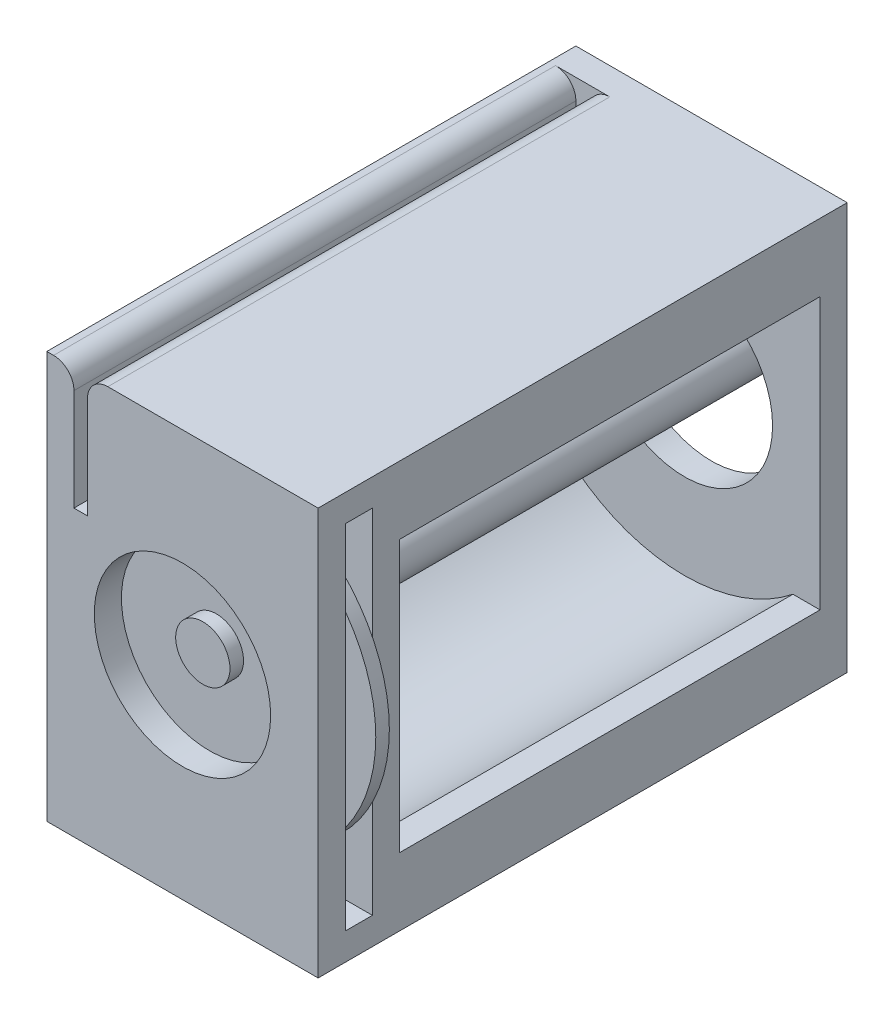
ISO-10303-21;
HEADER;
FILE_DESCRIPTION(('STEP AP214'),'2;1');
FILE_NAME('part.step','',(''),(''),'','','');
FILE_SCHEMA(('AUTOMOTIVE_DESIGN { 1 0 10303 214 1 1 1 1 }'));
ENDSEC;
DATA;
#1=APPLICATION_CONTEXT('core data for automotive mechanical design processes');
#2=APPLICATION_PROTOCOL_DEFINITION('international standard','automotive_design',2000,#1);
#3=PRODUCT_CONTEXT('',#1,'mechanical');
#4=PRODUCT('Part','Part','',(#3));
#5=PRODUCT_RELATED_PRODUCT_CATEGORY('part','',(#4));
#6=PRODUCT_DEFINITION_FORMATION('','',#4);
#7=PRODUCT_DEFINITION_CONTEXT('part definition',#1,'design');
#8=PRODUCT_DEFINITION('design','',#6,#7);
#9=PRODUCT_DEFINITION_SHAPE('','',#8);
#10=(LENGTH_UNIT() NAMED_UNIT(*) SI_UNIT(.MILLI.,.METRE.));
#11=(NAMED_UNIT(*) PLANE_ANGLE_UNIT() SI_UNIT($,.RADIAN.));
#12=(NAMED_UNIT(*) SI_UNIT($,.STERADIAN.) SOLID_ANGLE_UNIT());
#13=UNCERTAINTY_MEASURE_WITH_UNIT(LENGTH_MEASURE(1.E-05),#10,'distance_accuracy_value','');
#14=(GEOMETRIC_REPRESENTATION_CONTEXT(3) GLOBAL_UNCERTAINTY_ASSIGNED_CONTEXT((#13)) GLOBAL_UNIT_ASSIGNED_CONTEXT((#10,
#11,#12)) REPRESENTATION_CONTEXT('',''));
#15=CARTESIAN_POINT('',(0.,0.,0.));
#16=DIRECTION('',(0.,0.,1.));
#17=DIRECTION('',(1.,0.,0.));
#18=AXIS2_PLACEMENT_3D('',#15,#16,#17);
#19=CARTESIAN_POINT('',(0.,0.,-5.));
#20=DIRECTION('',(0.,0.,1.));
#21=DIRECTION('',(1.,0.,0.));
#22=AXIS2_PLACEMENT_3D('',#19,#20,#21);
#23=CYLINDRICAL_SURFACE('',#22,2.);
#24=CARTESIAN_POINT('',(0.,0.,-5.));
#25=DIRECTION('',(0.,0.,1.));
#26=DIRECTION('',(1.,0.,0.));
#27=AXIS2_PLACEMENT_3D('',#24,#25,#26);
#28=CIRCLE('',#27,2.);
#29=CARTESIAN_POINT('',(2.,0.,-5.));
#30=VERTEX_POINT('',#29);
#31=EDGE_CURVE('E11',#30,#30,#28,.T.);
#32=ORIENTED_EDGE('',*,*,#31,.T.);
#33=EDGE_LOOP('',(#32));
#34=FACE_BOUND('',#33,.T.);
#35=CARTESIAN_POINT('',(0.,0.,37.5));
#36=DIRECTION('',(0.,0.,1.));
#37=DIRECTION('',(1.,0.,0.));
#38=AXIS2_PLACEMENT_3D('',#35,#36,#37);
#39=CIRCLE('',#38,2.);
#40=CARTESIAN_POINT('',(2.,0.,37.5));
#41=VERTEX_POINT('',#40);
#42=EDGE_CURVE('E50',#41,#41,#39,.T.);
#43=ORIENTED_EDGE('',*,*,#42,.F.);
#44=EDGE_LOOP('',(#43));
#45=FACE_BOUND('',#44,.T.);
#46=ADVANCED_FACE('F44',(#34,#45),#23,.T.);
#47=CARTESIAN_POINT('',(0.,0.,-5.));
#48=DIRECTION('',(0.,0.,1.));
#49=DIRECTION('',(1.,0.,0.));
#50=AXIS2_PLACEMENT_3D('',#47,#48,#49);
#51=PLANE('',#50);
#52=ORIENTED_EDGE('',*,*,#31,.F.);
#53=EDGE_LOOP('',(#52));
#54=FACE_BOUND('',#53,.T.);
#55=ADVANCED_FACE('F59',(#54),#51,.F.);
#56=CARTESIAN_POINT('',(0.,0.,37.5));
#57=DIRECTION('',(0.,0.,1.));
#58=DIRECTION('',(1.,0.,0.));
#59=AXIS2_PLACEMENT_3D('',#56,#57,#58);
#60=PLANE('',#59);
#61=ORIENTED_EDGE('',*,*,#42,.T.);
#62=EDGE_LOOP('',(#61));
#63=FACE_BOUND('',#62,.T.);
#64=ADVANCED_FACE('F56',(#63),#60,.T.);
#65=CLOSED_SHELL('',(#46,#55,#64));
#66=MANIFOLD_SOLID_BREP('B2',#65);
#67=CARTESIAN_POINT('',(0.,0.,36.5));
#68=DIRECTION('',(0.,0.,1.));
#69=DIRECTION('',(1.,0.,0.));
#70=AXIS2_PLACEMENT_3D('',#67,#68,#69);
#71=PLANE('',#70);
#72=CARTESIAN_POINT('',(0.,0.,36.5));
#73=DIRECTION('',(0.,0.,1.));
#74=DIRECTION('',(1.,0.,0.));
#75=AXIS2_PLACEMENT_3D('',#72,#73,#74);
#76=CIRCLE('',#75,11.75);
#77=CARTESIAN_POINT('',(11.75,0.,36.5));
#78=VERTEX_POINT('',#77);
#79=EDGE_CURVE('E43',#78,#78,#76,.T.);
#80=ORIENTED_EDGE('',*,*,#79,.T.);
#81=EDGE_LOOP('',(#80));
#82=FACE_BOUND('',#81,.T.);
#83=CARTESIAN_POINT('',(0.,0.,36.5));
#84=DIRECTION('',(0.,0.,1.));
#85=DIRECTION('',(1.,0.,0.));
#86=AXIS2_PLACEMENT_3D('',#83,#84,#85);
#87=CIRCLE('',#86,2.);
#88=CARTESIAN_POINT('',(2.,0.,36.5));
#89=VERTEX_POINT('',#88);
#90=EDGE_CURVE('E105',#89,#89,#87,.T.);
#91=ORIENTED_EDGE('',*,*,#90,.F.);
#92=EDGE_LOOP('',(#91));
#93=FACE_BOUND('',#92,.T.);
#94=ADVANCED_FACE('F94',(#82,#93),#71,.T.);
#95=CARTESIAN_POINT('',(0.,0.,35.5));
#96=DIRECTION('',(0.,0.,1.));
#97=DIRECTION('',(1.,0.,0.));
#98=AXIS2_PLACEMENT_3D('',#95,#96,#97);
#99=PLANE('',#98);
#100=CARTESIAN_POINT('',(0.,0.,35.5));
#101=DIRECTION('',(0.,0.,1.));
#102=DIRECTION('',(1.,0.,0.));
#103=AXIS2_PLACEMENT_3D('',#100,#101,#102);
#104=CIRCLE('',#103,11.75);
#105=CARTESIAN_POINT('',(11.75,0.,35.5));
#106=VERTEX_POINT('',#105);
#107=EDGE_CURVE('E98',#106,#106,#104,.T.);
#108=ORIENTED_EDGE('',*,*,#107,.F.);
#109=EDGE_LOOP('',(#108));
#110=FACE_BOUND('',#109,.T.);
#111=CARTESIAN_POINT('',(0.,0.,35.5));
#112=DIRECTION('',(0.,0.,1.));
#113=DIRECTION('',(1.,0.,0.));
#114=AXIS2_PLACEMENT_3D('',#111,#112,#113);
#115=CIRCLE('',#114,2.);
#116=CARTESIAN_POINT('',(2.,0.,35.5));
#117=VERTEX_POINT('',#116);
#118=EDGE_CURVE('E107',#117,#117,#115,.T.);
#119=ORIENTED_EDGE('',*,*,#118,.T.);
#120=EDGE_LOOP('',(#119));
#121=FACE_BOUND('',#120,.T.);
#122=ADVANCED_FACE('F117',(#110,#121),#99,.F.);
#123=CARTESIAN_POINT('',(0.,0.,36.5));
#124=DIRECTION('',(0.,0.,-1.));
#125=DIRECTION('',(-1.,0.,0.));
#126=AXIS2_PLACEMENT_3D('',#123,#124,#125);
#127=CYLINDRICAL_SURFACE('',#126,11.75);
#128=ORIENTED_EDGE('',*,*,#79,.F.);
#129=EDGE_LOOP('',(#128));
#130=FACE_BOUND('',#129,.T.);
#131=ORIENTED_EDGE('',*,*,#107,.T.);
#132=EDGE_LOOP('',(#131));
#133=FACE_BOUND('',#132,.T.);
#134=ADVANCED_FACE('F96',(#130,#133),#127,.T.);
#135=CARTESIAN_POINT('',(0.,0.,36.5));
#136=DIRECTION('',(0.,0.,-1.));
#137=DIRECTION('',(-1.,0.,0.));
#138=AXIS2_PLACEMENT_3D('',#135,#136,#137);
#139=CYLINDRICAL_SURFACE('',#138,2.);
#140=ORIENTED_EDGE('',*,*,#90,.T.);
#141=EDGE_LOOP('',(#140));
#142=FACE_BOUND('',#141,.T.);
#143=ORIENTED_EDGE('',*,*,#118,.F.);
#144=EDGE_LOOP('',(#143));
#145=FACE_BOUND('',#144,.T.);
#146=ADVANCED_FACE('F113',(#142,#145),#139,.F.);
#147=CLOSED_SHELL('',(#94,#122,#134,#146));
#148=MANIFOLD_SOLID_BREP('B6',#147);
#149=CARTESIAN_POINT('',(0.,13.,39.));
#150=DIRECTION('',(0.,1.,0.));
#151=DIRECTION('',(0.,0.,1.));
#152=AXIS2_PLACEMENT_3D('',#149,#150,#151);
#153=PLANE('',#152);
#154=DIRECTION('',(-1.,0.,0.));
#155=VECTOR('',#154,1.);
#156=CARTESIAN_POINT('',(0.,13.,35.));
#157=LINE('',#156,#155);
#158=CARTESIAN_POINT('',(-8.,13.,35.));
#159=VERTEX_POINT('',#158);
#160=CARTESIAN_POINT('',(-10.,13.,35.));
#161=VERTEX_POINT('',#160);
#162=EDGE_CURVE('E525',#159,#161,#157,.T.);
#163=ORIENTED_EDGE('',*,*,#162,.F.);
#164=DIRECTION('',(0.,0.,1.));
#165=VECTOR('',#164,1.);
#166=CARTESIAN_POINT('',(-8.,13.,39.));
#167=LINE('',#166,#165);
#168=CARTESIAN_POINT('',(-8.,13.,37.));
#169=VERTEX_POINT('',#168);
#170=EDGE_CURVE('E382',#159,#169,#167,.T.);
#171=ORIENTED_EDGE('',*,*,#170,.T.);
#172=DIRECTION('',(1.,0.,0.));
#173=VECTOR('',#172,1.);
#174=CARTESIAN_POINT('',(0.,13.,37.));
#175=LINE('',#174,#173);
#176=CARTESIAN_POINT('',(-10.,13.,37.));
#177=VERTEX_POINT('',#176);
#178=EDGE_CURVE('E530',#177,#169,#175,.T.);
#179=ORIENTED_EDGE('',*,*,#178,.F.);
#180=DIRECTION('',(0.,0.,-1.));
#181=VECTOR('',#180,1.);
#182=CARTESIAN_POINT('',(-10.,13.,39.));
#183=LINE('',#182,#181);
#184=EDGE_CURVE('E420',#177,#161,#183,.T.);
#185=ORIENTED_EDGE('',*,*,#184,.T.);
#186=EDGE_LOOP('',(#163,#171,#179,#185));
#187=FACE_BOUND('',#186,.T.);
#188=ADVANCED_FACE('F156',(#187),#153,.F.);
#189=CARTESIAN_POINT('',(-7.,13.,37.));
#190=VERTEX_POINT('',#189);
#191=CARTESIAN_POINT('',(10.,13.,37.));
#192=VERTEX_POINT('',#191);
#193=EDGE_CURVE('E529',#190,#192,#175,.T.);
#194=ORIENTED_EDGE('',*,*,#193,.F.);
#195=DIRECTION('',(0.,0.,-1.));
#196=VECTOR('',#195,1.);
#197=CARTESIAN_POINT('',(-7.,13.,39.));
#198=LINE('',#197,#196);
#199=CARTESIAN_POINT('',(-7.,13.,35.));
#200=VERTEX_POINT('',#199);
#201=EDGE_CURVE('E371',#190,#200,#198,.T.);
#202=ORIENTED_EDGE('',*,*,#201,.T.);
#203=CARTESIAN_POINT('',(10.,13.,35.));
#204=VERTEX_POINT('',#203);
#205=EDGE_CURVE('E526',#204,#200,#157,.T.);
#206=ORIENTED_EDGE('',*,*,#205,.F.);
#207=DIRECTION('',(0.,0.,-1.));
#208=VECTOR('',#207,1.);
#209=CARTESIAN_POINT('',(10.,13.,39.));
#210=LINE('',#209,#208);
#211=EDGE_CURVE('E423',#192,#204,#210,.T.);
#212=ORIENTED_EDGE('',*,*,#211,.F.);
#213=EDGE_LOOP('',(#194,#202,#206,#212));
#214=FACE_BOUND('',#213,.T.);
#215=ADVANCED_FACE('F650',(#214),#153,.F.);
#216=CARTESIAN_POINT('',(0.,0.,35.));
#217=DIRECTION('',(0.,0.,1.));
#218=DIRECTION('',(1.,0.,0.));
#219=AXIS2_PLACEMENT_3D('',#216,#217,#218);
#220=PLANE('',#219);
#221=DIRECTION('',(0.,-1.,0.));
#222=VECTOR('',#221,1.);
#223=CARTESIAN_POINT('',(-7.99999999999999,0.,35.));
#224=LINE('',#223,#222);
#225=CARTESIAN_POINT('',(-8.,6.,35.));
#226=VERTEX_POINT('',#225);
#227=EDGE_CURVE('E385',#159,#226,#224,.T.);
#228=ORIENTED_EDGE('',*,*,#227,.F.);
#229=ORIENTED_EDGE('',*,*,#162,.T.);
#230=DIRECTION('',(0.,-1.,0.));
#231=VECTOR('',#230,1.);
#232=CARTESIAN_POINT('',(-10.,0.,35.));
#233=LINE('',#232,#231);
#234=CARTESIAN_POINT('',(-10.,-13.,35.));
#235=VERTEX_POINT('',#234);
#236=EDGE_CURVE('E429',#161,#235,#233,.T.);
#237=ORIENTED_EDGE('',*,*,#236,.T.);
#238=DIRECTION('',(-1.,0.,0.));
#239=VECTOR('',#238,1.);
#240=CARTESIAN_POINT('',(0.,-13.,35.));
#241=LINE('',#240,#239);
#242=CARTESIAN_POINT('',(10.,-13.,35.));
#243=VERTEX_POINT('',#242);
#244=EDGE_CURVE('E395',#243,#235,#241,.T.);
#245=ORIENTED_EDGE('',*,*,#244,.F.);
#246=DIRECTION('',(0.,-1.,0.));
#247=VECTOR('',#246,1.);
#248=CARTESIAN_POINT('',(10.,0.,35.));
#249=LINE('',#248,#247);
#250=EDGE_CURVE('E426',#204,#243,#249,.T.);
#251=ORIENTED_EDGE('',*,*,#250,.F.);
#252=ORIENTED_EDGE('',*,*,#205,.T.);
#253=DIRECTION('',(0.,1.,0.));
#254=VECTOR('',#253,1.);
#255=CARTESIAN_POINT('',(-6.99999999999999,0.,35.));
#256=LINE('',#255,#254);
#257=CARTESIAN_POINT('',(-7.,6.,35.));
#258=VERTEX_POINT('',#257);
#259=EDGE_CURVE('E374',#258,#200,#256,.T.);
#260=ORIENTED_EDGE('',*,*,#259,.F.);
#261=DIRECTION('',(1.,0.,0.));
#262=VECTOR('',#261,1.);
#263=CARTESIAN_POINT('',(0.,6.,35.));
#264=LINE('',#263,#262);
#265=EDGE_CURVE('E369',#226,#258,#264,.T.);
#266=ORIENTED_EDGE('',*,*,#265,.F.);
#267=EDGE_LOOP('',(#228,#229,#237,#245,#251,#252,#260,#266));
#268=FACE_BOUND('',#267,.T.);
#269=CARTESIAN_POINT('',(0.,0.,35.));
#270=DIRECTION('',(0.,0.,1.));
#271=DIRECTION('',(1.,0.,0.));
#272=AXIS2_PLACEMENT_3D('',#269,#270,#271);
#273=CIRCLE('',#272,6.5);
#274=CARTESIAN_POINT('',(6.5,0.,35.));
#275=VERTEX_POINT('',#274);
#276=EDGE_CURVE('E433',#275,#275,#273,.T.);
#277=ORIENTED_EDGE('',*,*,#276,.F.);
#278=EDGE_LOOP('',(#277));
#279=FACE_BOUND('',#278,.T.);
#280=ADVANCED_FACE('F603',(#268,#279),#220,.T.);
#281=CARTESIAN_POINT('',(0.,10.,34.));
#282=DIRECTION('',(0.,1.,0.));
#283=DIRECTION('',(0.,0.,1.));
#284=AXIS2_PLACEMENT_3D('',#281,#282,#283);
#285=PLANE('',#284);
#286=DIRECTION('',(1.,0.,0.));
#287=VECTOR('',#286,1.);
#288=CARTESIAN_POINT('',(0.,10.,33.));
#289=LINE('',#288,#287);
#290=CARTESIAN_POINT('',(8.,10.,33.));
#291=VERTEX_POINT('',#290);
#292=CARTESIAN_POINT('',(10.,10.,33.));
#293=VERTEX_POINT('',#292);
#294=EDGE_CURVE('E453',#291,#293,#289,.T.);
#295=ORIENTED_EDGE('',*,*,#294,.F.);
#296=DIRECTION('',(0.,0.,-1.));
#297=VECTOR('',#296,1.);
#298=CARTESIAN_POINT('',(8.,10.,34.));
#299=LINE('',#298,#297);
#300=CARTESIAN_POINT('',(8.,10.,2.));
#301=VERTEX_POINT('',#300);
#302=EDGE_CURVE('E473',#291,#301,#299,.T.);
#303=ORIENTED_EDGE('',*,*,#302,.T.);
#304=DIRECTION('',(-1.,0.,0.));
#305=VECTOR('',#304,1.);
#306=CARTESIAN_POINT('',(0.,10.,2.));
#307=LINE('',#306,#305);
#308=CARTESIAN_POINT('',(10.,10.,2.));
#309=VERTEX_POINT('',#308);
#310=EDGE_CURVE('E488',#309,#301,#307,.T.);
#311=ORIENTED_EDGE('',*,*,#310,.F.);
#312=DIRECTION('',(0.,0.,-1.));
#313=VECTOR('',#312,1.);
#314=CARTESIAN_POINT('',(10.,10.,34.));
#315=LINE('',#314,#313);
#316=EDGE_CURVE('E480',#293,#309,#315,.T.);
#317=ORIENTED_EDGE('',*,*,#316,.F.);
#318=EDGE_LOOP('',(#295,#303,#311,#317));
#319=FACE_BOUND('',#318,.T.);
#320=ADVANCED_FACE('F642',(#319),#285,.F.);
#321=CARTESIAN_POINT('',(0.,10.,34.));
#322=DIRECTION('',(0.,1.,0.));
#323=DIRECTION('',(0.,0.,1.));
#324=AXIS2_PLACEMENT_3D('',#321,#322,#323);
#325=PLANE('',#324);
#326=DIRECTION('',(1.,0.,0.));
#327=VECTOR('',#326,1.);
#328=CARTESIAN_POINT('',(0.,10.,33.));
#329=LINE('',#328,#327);
#330=CARTESIAN_POINT('',(-10.,10.,33.));
#331=VERTEX_POINT('',#330);
#332=CARTESIAN_POINT('',(-8.,10.,33.));
#333=VERTEX_POINT('',#332);
#334=EDGE_CURVE('E450',#331,#333,#329,.T.);
#335=ORIENTED_EDGE('',*,*,#334,.F.);
#336=DIRECTION('',(0.,0.,-1.));
#337=VECTOR('',#336,1.);
#338=CARTESIAN_POINT('',(-10.,10.,34.));
#339=LINE('',#338,#337);
#340=CARTESIAN_POINT('',(-10.,10.,2.));
#341=VERTEX_POINT('',#340);
#342=EDGE_CURVE('E478',#331,#341,#339,.T.);
#343=ORIENTED_EDGE('',*,*,#342,.T.);
#344=DIRECTION('',(-1.,0.,0.));
#345=VECTOR('',#344,1.);
#346=CARTESIAN_POINT('',(0.,10.,2.));
#347=LINE('',#346,#345);
#348=CARTESIAN_POINT('',(-8.,10.,2.));
#349=VERTEX_POINT('',#348);
#350=EDGE_CURVE('E485',#349,#341,#347,.T.);
#351=ORIENTED_EDGE('',*,*,#350,.F.);
#352=DIRECTION('',(0.,0.,-1.));
#353=VECTOR('',#352,1.);
#354=CARTESIAN_POINT('',(-8.,10.,34.));
#355=LINE('',#354,#353);
#356=EDGE_CURVE('E475',#333,#349,#355,.T.);
#357=ORIENTED_EDGE('',*,*,#356,.F.);
#358=EDGE_LOOP('',(#335,#343,#351,#357));
#359=FACE_BOUND('',#358,.T.);
#360=ADVANCED_FACE('F620',(#359),#325,.F.);
#361=CARTESIAN_POINT('',(0.,0.,34.));
#362=DIRECTION('',(0.,0.,-1.));
#363=DIRECTION('',(-1.,0.,0.));
#364=AXIS2_PLACEMENT_3D('',#361,#362,#363);
#365=CYLINDRICAL_SURFACE('',#364,12.8062484748657);
#366=CARTESIAN_POINT('',(0.,0.,33.));
#367=DIRECTION('',(0.,0.,1.));
#368=DIRECTION('',(1.,0.,0.));
#369=AXIS2_PLACEMENT_3D('',#366,#367,#368);
#370=CIRCLE('',#369,12.8062484748657);
#371=CARTESIAN_POINT('',(-7.,10.7238052947636,33.));
#372=VERTEX_POINT('',#371);
#373=EDGE_CURVE('E448',#372,#291,#370,.F.);
#374=ORIENTED_EDGE('',*,*,#373,.F.);
#375=DIRECTION('',(0.,0.,-1.));
#376=VECTOR('',#375,1.);
#377=CARTESIAN_POINT('',(-7.,10.7238052947636,34.));
#378=LINE('',#377,#376);
#379=CARTESIAN_POINT('',(-7.,10.7238052947636,2.));
#380=VERTEX_POINT('',#379);
#381=EDGE_CURVE('E379',#372,#380,#378,.T.);
#382=ORIENTED_EDGE('',*,*,#381,.T.);
#383=CARTESIAN_POINT('',(0.,0.,2.));
#384=DIRECTION('',(0.,0.,1.));
#385=DIRECTION('',(1.,0.,0.));
#386=AXIS2_PLACEMENT_3D('',#383,#384,#385);
#387=CIRCLE('',#386,12.8062484748657);
#388=EDGE_CURVE('E482',#301,#380,#387,.T.);
#389=ORIENTED_EDGE('',*,*,#388,.F.);
#390=ORIENTED_EDGE('',*,*,#302,.F.);
#391=EDGE_LOOP('',(#374,#382,#389,#390));
#392=FACE_BOUND('',#391,.T.);
#393=ADVANCED_FACE('F645',(#392),#365,.F.);
#394=CARTESIAN_POINT('',(0.,-10.,34.));
#395=DIRECTION('',(0.,1.,0.));
#396=DIRECTION('',(0.,0.,1.));
#397=AXIS2_PLACEMENT_3D('',#394,#395,#396);
#398=PLANE('',#397);
#399=DIRECTION('',(0.,0.,-1.));
#400=VECTOR('',#399,1.);
#401=CARTESIAN_POINT('',(8.,-10.,34.));
#402=LINE('',#401,#400);
#403=CARTESIAN_POINT('',(8.,-10.,33.));
#404=VERTEX_POINT('',#403);
#405=CARTESIAN_POINT('',(8.,-10.,2.));
#406=VERTEX_POINT('',#405);
#407=EDGE_CURVE('E460',#404,#406,#402,.T.);
#408=ORIENTED_EDGE('',*,*,#407,.F.);
#409=DIRECTION('',(1.,0.,0.));
#410=VECTOR('',#409,1.);
#411=CARTESIAN_POINT('',(0.,-10.,33.));
#412=LINE('',#411,#410);
#413=CARTESIAN_POINT('',(10.,-10.,33.));
#414=VERTEX_POINT('',#413);
#415=EDGE_CURVE('E446',#404,#414,#412,.T.);
#416=ORIENTED_EDGE('',*,*,#415,.T.);
#417=DIRECTION('',(0.,0.,-1.));
#418=VECTOR('',#417,1.);
#419=CARTESIAN_POINT('',(10.,-10.,34.));
#420=LINE('',#419,#418);
#421=CARTESIAN_POINT('',(10.,-10.,2.));
#422=VERTEX_POINT('',#421);
#423=EDGE_CURVE('E462',#414,#422,#420,.T.);
#424=ORIENTED_EDGE('',*,*,#423,.T.);
#425=DIRECTION('',(-1.,0.,0.));
#426=VECTOR('',#425,1.);
#427=CARTESIAN_POINT('',(0.,-10.,2.));
#428=LINE('',#427,#426);
#429=EDGE_CURVE('E470',#422,#406,#428,.T.);
#430=ORIENTED_EDGE('',*,*,#429,.T.);
#431=EDGE_LOOP('',(#408,#416,#424,#430));
#432=FACE_BOUND('',#431,.T.);
#433=ADVANCED_FACE('F636',(#432),#398,.T.);
#434=CARTESIAN_POINT('',(0.,0.,34.));
#435=DIRECTION('',(0.,0.,-1.));
#436=DIRECTION('',(-1.,0.,0.));
#437=AXIS2_PLACEMENT_3D('',#434,#435,#436);
#438=CYLINDRICAL_SURFACE('',#437,12.8062484748657);
#439=CARTESIAN_POINT('',(0.,0.,33.));
#440=DIRECTION('',(0.,0.,1.));
#441=DIRECTION('',(1.,0.,0.));
#442=AXIS2_PLACEMENT_3D('',#439,#440,#441);
#443=CIRCLE('',#442,12.8062484748657);
#444=CARTESIAN_POINT('',(-8.,-10.,33.));
#445=VERTEX_POINT('',#444);
#446=EDGE_CURVE('E436',#404,#445,#443,.F.);
#447=ORIENTED_EDGE('',*,*,#446,.F.);
#448=ORIENTED_EDGE('',*,*,#407,.T.);
#449=CARTESIAN_POINT('',(0.,0.,2.));
#450=DIRECTION('',(0.,0.,1.));
#451=DIRECTION('',(1.,0.,0.));
#452=AXIS2_PLACEMENT_3D('',#449,#450,#451);
#453=CIRCLE('',#452,12.8062484748657);
#454=CARTESIAN_POINT('',(-8.,-10.,2.));
#455=VERTEX_POINT('',#454);
#456=EDGE_CURVE('E467',#455,#406,#453,.T.);
#457=ORIENTED_EDGE('',*,*,#456,.F.);
#458=DIRECTION('',(0.,0.,-1.));
#459=VECTOR('',#458,1.);
#460=CARTESIAN_POINT('',(-8.,-10.,34.));
#461=LINE('',#460,#459);
#462=EDGE_CURVE('E458',#445,#455,#461,.T.);
#463=ORIENTED_EDGE('',*,*,#462,.F.);
#464=EDGE_LOOP('',(#447,#448,#457,#463));
#465=FACE_BOUND('',#464,.T.);
#466=ADVANCED_FACE('F632',(#465),#438,.F.);
#467=CARTESIAN_POINT('',(0.,-10.,34.));
#468=DIRECTION('',(0.,1.,0.));
#469=DIRECTION('',(0.,0.,1.));
#470=AXIS2_PLACEMENT_3D('',#467,#468,#469);
#471=PLANE('',#470);
#472=DIRECTION('',(0.,0.,-1.));
#473=VECTOR('',#472,1.);
#474=CARTESIAN_POINT('',(-10.,-10.,34.));
#475=LINE('',#474,#473);
#476=CARTESIAN_POINT('',(-10.,-10.,33.));
#477=VERTEX_POINT('',#476);
#478=CARTESIAN_POINT('',(-10.,-10.,2.));
#479=VERTEX_POINT('',#478);
#480=EDGE_CURVE('E456',#477,#479,#475,.T.);
#481=ORIENTED_EDGE('',*,*,#480,.F.);
#482=DIRECTION('',(1.,0.,0.));
#483=VECTOR('',#482,1.);
#484=CARTESIAN_POINT('',(0.,-10.,33.));
#485=LINE('',#484,#483);
#486=EDGE_CURVE('E523',#477,#445,#485,.T.);
#487=ORIENTED_EDGE('',*,*,#486,.T.);
#488=ORIENTED_EDGE('',*,*,#462,.T.);
#489=DIRECTION('',(-1.,0.,0.));
#490=VECTOR('',#489,1.);
#491=CARTESIAN_POINT('',(0.,-10.,2.));
#492=LINE('',#491,#490);
#493=EDGE_CURVE('E464',#455,#479,#492,.T.);
#494=ORIENTED_EDGE('',*,*,#493,.T.);
#495=EDGE_LOOP('',(#481,#487,#488,#494));
#496=FACE_BOUND('',#495,.T.);
#497=ADVANCED_FACE('F626',(#496),#471,.T.);
#498=CARTESIAN_POINT('',(0.,0.,2.));
#499=DIRECTION('',(0.,0.,1.));
#500=DIRECTION('',(1.,0.,0.));
#501=AXIS2_PLACEMENT_3D('',#498,#499,#500);
#502=PLANE('',#501);
#503=ORIENTED_EDGE('',*,*,#388,.T.);
#504=DIRECTION('',(0.,1.,0.));
#505=VECTOR('',#504,1.);
#506=CARTESIAN_POINT('',(-7.,15.,2.));
#507=LINE('',#506,#505);
#508=CARTESIAN_POINT('',(-7.,13.5,2.));
#509=VERTEX_POINT('',#508);
#510=EDGE_CURVE('E361',#380,#509,#507,.T.);
#511=ORIENTED_EDGE('',*,*,#510,.T.);
#512=CARTESIAN_POINT('',(-5.5,13.5,2.));
#513=DIRECTION('',(0.,0.,1.));
#514=DIRECTION('',(1.,0.,0.));
#515=AXIS2_PLACEMENT_3D('',#512,#513,#514);
#516=CIRCLE('',#515,1.5);
#517=CARTESIAN_POINT('',(-5.5,15.,2.));
#518=VERTEX_POINT('',#517);
#519=EDGE_CURVE('E92',#509,#518,#516,.F.);
#520=ORIENTED_EDGE('',*,*,#519,.T.);
#521=DIRECTION('',(-1.,0.,0.));
#522=VECTOR('',#521,1.);
#523=CARTESIAN_POINT('',(-8.,15.,2.));
#524=LINE('',#523,#522);
#525=CARTESIAN_POINT('',(-9.5,15.,2.));
#526=VERTEX_POINT('',#525);
#527=EDGE_CURVE('E178',#518,#526,#524,.T.);
#528=ORIENTED_EDGE('',*,*,#527,.T.);
#529=CARTESIAN_POINT('',(-9.5,13.5,2.));
#530=DIRECTION('',(0.,0.,1.));
#531=DIRECTION('',(1.,0.,0.));
#532=AXIS2_PLACEMENT_3D('',#529,#530,#531);
#533=CIRCLE('',#532,1.5);
#534=CARTESIAN_POINT('',(-8.,13.5,2.));
#535=VERTEX_POINT('',#534);
#536=EDGE_CURVE('E164',#526,#535,#533,.F.);
#537=ORIENTED_EDGE('',*,*,#536,.T.);
#538=DIRECTION('',(0.,-1.,0.));
#539=VECTOR('',#538,1.);
#540=CARTESIAN_POINT('',(-8.,15.,2.));
#541=LINE('',#540,#539);
#542=EDGE_CURVE('E359',#535,#349,#541,.T.);
#543=ORIENTED_EDGE('',*,*,#542,.T.);
#544=ORIENTED_EDGE('',*,*,#350,.T.);
#545=DIRECTION('',(0.,-1.,0.));
#546=VECTOR('',#545,1.);
#547=CARTESIAN_POINT('',(-10.,0.,2.));
#548=LINE('',#547,#546);
#549=EDGE_CURVE('E495',#341,#479,#548,.T.);
#550=ORIENTED_EDGE('',*,*,#549,.T.);
#551=ORIENTED_EDGE('',*,*,#493,.F.);
#552=ORIENTED_EDGE('',*,*,#456,.T.);
#553=ORIENTED_EDGE('',*,*,#429,.F.);
#554=DIRECTION('',(0.,-1.,0.));
#555=VECTOR('',#554,1.);
#556=CARTESIAN_POINT('',(10.,0.,2.));
#557=LINE('',#556,#555);
#558=EDGE_CURVE('E492',#309,#422,#557,.T.);
#559=ORIENTED_EDGE('',*,*,#558,.F.);
#560=ORIENTED_EDGE('',*,*,#310,.T.);
#561=EDGE_LOOP('',(#503,#511,#520,#528,#537,#543,#544,#550,#551,#552,#553,#559,#560));
#562=FACE_BOUND('',#561,.T.);
#563=CARTESIAN_POINT('',(0.,0.,2.));
#564=DIRECTION('',(0.,0.,1.));
#565=DIRECTION('',(1.,0.,0.));
#566=AXIS2_PLACEMENT_3D('',#563,#564,#565);
#567=CIRCLE('',#566,6.5);
#568=CARTESIAN_POINT('',(6.5,0.,2.));
#569=VERTEX_POINT('',#568);
#570=EDGE_CURVE('E499',#569,#569,#567,.T.);
#571=ORIENTED_EDGE('',*,*,#570,.F.);
#572=EDGE_LOOP('',(#571));
#573=FACE_BOUND('',#572,.T.);
#574=ADVANCED_FACE('F554',(#562,#573),#502,.T.);
#575=CARTESIAN_POINT('',(10.,0.,2.));
#576=DIRECTION('',(1.,0.,0.));
#577=DIRECTION('',(0.,1.,0.));
#578=AXIS2_PLACEMENT_3D('',#575,#576,#577);
#579=PLANE('',#578);
#580=ORIENTED_EDGE('',*,*,#250,.T.);
#581=DIRECTION('',(0.,0.,-1.));
#582=VECTOR('',#581,1.);
#583=CARTESIAN_POINT('',(10.,-13.,39.));
#584=LINE('',#583,#582);
#585=CARTESIAN_POINT('',(10.,-13.,37.));
#586=VERTEX_POINT('',#585);
#587=EDGE_CURVE('E390',#586,#243,#584,.T.);
#588=ORIENTED_EDGE('',*,*,#587,.F.);
#589=DIRECTION('',(0.,-1.,0.));
#590=VECTOR('',#589,1.);
#591=CARTESIAN_POINT('',(10.,0.,37.));
#592=LINE('',#591,#590);
#593=EDGE_CURVE('E397',#192,#586,#592,.T.);
#594=ORIENTED_EDGE('',*,*,#593,.F.);
#595=ORIENTED_EDGE('',*,*,#211,.T.);
#596=EDGE_LOOP('',(#580,#588,#594,#595));
#597=FACE_BOUND('',#596,.T.);
#598=DIRECTION('',(0.,-1.,0.));
#599=VECTOR('',#598,1.);
#600=CARTESIAN_POINT('',(10.,0.,39.));
#601=LINE('',#600,#599);
#602=CARTESIAN_POINT('',(10.,15.,39.));
#603=VERTEX_POINT('',#602);
#604=CARTESIAN_POINT('',(10.,-15.,39.));
#605=VERTEX_POINT('',#604);
#606=EDGE_CURVE('E405',#603,#605,#601,.T.);
#607=ORIENTED_EDGE('',*,*,#606,.T.);
#608=DIRECTION('',(0.,0.,-1.));
#609=VECTOR('',#608,1.);
#610=CARTESIAN_POINT('',(10.,-15.,2.));
#611=LINE('',#610,#609);
#612=CARTESIAN_POINT('',(10.,-15.,0.));
#613=VERTEX_POINT('',#612);
#614=EDGE_CURVE('E502',#605,#613,#611,.T.);
#615=ORIENTED_EDGE('',*,*,#614,.T.);
#616=DIRECTION('',(0.,-1.,0.));
#617=VECTOR('',#616,1.);
#618=CARTESIAN_POINT('',(10.,0.,0.));
#619=LINE('',#618,#617);
#620=CARTESIAN_POINT('',(10.,15.,0.));
#621=VERTEX_POINT('',#620);
#622=EDGE_CURVE('E491',#621,#613,#619,.T.);
#623=ORIENTED_EDGE('',*,*,#622,.F.);
#624=DIRECTION('',(0.,0.,-1.));
#625=VECTOR('',#624,1.);
#626=CARTESIAN_POINT('',(10.,15.,2.));
#627=LINE('',#626,#625);
#628=EDGE_CURVE('E521',#603,#621,#627,.T.);
#629=ORIENTED_EDGE('',*,*,#628,.F.);
#630=EDGE_LOOP('',(#607,#615,#623,#629));
#631=FACE_BOUND('',#630,.T.);
#632=DIRECTION('',(0.,-1.,0.));
#633=VECTOR('',#632,1.);
#634=CARTESIAN_POINT('',(10.,0.,33.));
#635=LINE('',#634,#633);
#636=EDGE_CURVE('E425',#293,#414,#635,.T.);
#637=ORIENTED_EDGE('',*,*,#636,.F.);
#638=ORIENTED_EDGE('',*,*,#316,.T.);
#639=ORIENTED_EDGE('',*,*,#558,.T.);
#640=ORIENTED_EDGE('',*,*,#423,.F.);
#641=EDGE_LOOP('',(#637,#638,#639,#640));
#642=FACE_BOUND('',#641,.T.);
#643=ADVANCED_FACE('F581',(#597,#631,#642),#579,.T.);
#644=CARTESIAN_POINT('',(0.,15.,2.));
#645=DIRECTION('',(0.,-1.,0.));
#646=DIRECTION('',(1.,0.,0.));
#647=AXIS2_PLACEMENT_3D('',#644,#645,#646);
#648=PLANE('',#647);
#649=DIRECTION('',(-1.,0.,0.));
#650=VECTOR('',#649,1.);
#651=CARTESIAN_POINT('',(0.,15.,39.));
#652=LINE('',#651,#650);
#653=CARTESIAN_POINT('',(-9.5,15.,39.));
#654=VERTEX_POINT('',#653);
#655=CARTESIAN_POINT('',(-10.,15.,39.));
#656=VERTEX_POINT('',#655);
#657=EDGE_CURVE('E414',#654,#656,#652,.T.);
#658=ORIENTED_EDGE('',*,*,#657,.F.);
#659=DIRECTION('',(0.,0.,1.));
#660=VECTOR('',#659,1.);
#661=CARTESIAN_POINT('',(-9.5,15.,2.));
#662=LINE('',#661,#660);
#663=EDGE_CURVE('E550',#654,#526,#662,.F.);
#664=ORIENTED_EDGE('',*,*,#663,.T.);
#665=ORIENTED_EDGE('',*,*,#527,.F.);
#666=DIRECTION('',(0.,0.,1.));
#667=VECTOR('',#666,1.);
#668=CARTESIAN_POINT('',(-5.5,15.,2.));
#669=LINE('',#668,#667);
#670=CARTESIAN_POINT('',(-5.5,15.,39.));
#671=VERTEX_POINT('',#670);
#672=EDGE_CURVE('E547',#518,#671,#669,.T.);
#673=ORIENTED_EDGE('',*,*,#672,.T.);
#674=EDGE_CURVE('E415',#603,#671,#652,.T.);
#675=ORIENTED_EDGE('',*,*,#674,.F.);
#676=ORIENTED_EDGE('',*,*,#628,.T.);
#677=DIRECTION('',(-1.,0.,0.));
#678=VECTOR('',#677,1.);
#679=CARTESIAN_POINT('',(0.,15.,0.));
#680=LINE('',#679,#678);
#681=CARTESIAN_POINT('',(-10.,15.,0.));
#682=VERTEX_POINT('',#681);
#683=EDGE_CURVE('E504',#621,#682,#680,.T.);
#684=ORIENTED_EDGE('',*,*,#683,.T.);
#685=DIRECTION('',(0.,0.,-1.));
#686=VECTOR('',#685,1.);
#687=CARTESIAN_POINT('',(-10.,15.,2.));
#688=LINE('',#687,#686);
#689=EDGE_CURVE('E519',#656,#682,#688,.T.);
#690=ORIENTED_EDGE('',*,*,#689,.F.);
#691=EDGE_LOOP('',(#658,#664,#665,#673,#675,#676,#684,#690));
#692=FACE_BOUND('',#691,.T.);
#693=ADVANCED_FACE('F567',(#692),#648,.F.);
#694=CARTESIAN_POINT('',(-10.,0.,2.));
#695=DIRECTION('',(1.,0.,0.));
#696=DIRECTION('',(0.,1.,0.));
#697=AXIS2_PLACEMENT_3D('',#694,#695,#696);
#698=PLANE('',#697);
#699=DIRECTION('',(0.,0.,-1.));
#700=VECTOR('',#699,1.);
#701=CARTESIAN_POINT('',(-10.,-13.,39.));
#702=LINE('',#701,#700);
#703=CARTESIAN_POINT('',(-10.,-13.,37.));
#704=VERTEX_POINT('',#703);
#705=EDGE_CURVE('E392',#704,#235,#702,.T.);
#706=ORIENTED_EDGE('',*,*,#705,.T.);
#707=ORIENTED_EDGE('',*,*,#236,.F.);
#708=ORIENTED_EDGE('',*,*,#184,.F.);
#709=DIRECTION('',(0.,-1.,0.));
#710=VECTOR('',#709,1.);
#711=CARTESIAN_POINT('',(-10.,0.,37.));
#712=LINE('',#711,#710);
#713=EDGE_CURVE('E407',#177,#704,#712,.T.);
#714=ORIENTED_EDGE('',*,*,#713,.T.);
#715=EDGE_LOOP('',(#706,#707,#708,#714));
#716=FACE_BOUND('',#715,.T.);
#717=DIRECTION('',(0.,-1.,0.));
#718=VECTOR('',#717,1.);
#719=CARTESIAN_POINT('',(-10.,0.,0.));
#720=LINE('',#719,#718);
#721=CARTESIAN_POINT('',(-10.,-15.,0.));
#722=VERTEX_POINT('',#721);
#723=EDGE_CURVE('E507',#682,#722,#720,.T.);
#724=ORIENTED_EDGE('',*,*,#723,.T.);
#725=DIRECTION('',(0.,0.,-1.));
#726=VECTOR('',#725,1.);
#727=CARTESIAN_POINT('',(-10.,-15.,2.));
#728=LINE('',#727,#726);
#729=CARTESIAN_POINT('',(-10.,-15.,39.));
#730=VERTEX_POINT('',#729);
#731=EDGE_CURVE('E516',#730,#722,#728,.T.);
#732=ORIENTED_EDGE('',*,*,#731,.F.);
#733=DIRECTION('',(0.,-1.,0.));
#734=VECTOR('',#733,1.);
#735=CARTESIAN_POINT('',(-10.,0.,39.));
#736=LINE('',#735,#734);
#737=EDGE_CURVE('E417',#656,#730,#736,.T.);
#738=ORIENTED_EDGE('',*,*,#737,.F.);
#739=ORIENTED_EDGE('',*,*,#689,.T.);
#740=EDGE_LOOP('',(#724,#732,#738,#739));
#741=FACE_BOUND('',#740,.T.);
#742=ORIENTED_EDGE('',*,*,#342,.F.);
#743=DIRECTION('',(0.,-1.,0.));
#744=VECTOR('',#743,1.);
#745=CARTESIAN_POINT('',(-10.,0.,33.));
#746=LINE('',#745,#744);
#747=EDGE_CURVE('E439',#331,#477,#746,.T.);
#748=ORIENTED_EDGE('',*,*,#747,.T.);
#749=ORIENTED_EDGE('',*,*,#480,.T.);
#750=ORIENTED_EDGE('',*,*,#549,.F.);
#751=EDGE_LOOP('',(#742,#748,#749,#750));
#752=FACE_BOUND('',#751,.T.);
#753=ADVANCED_FACE('F572',(#716,#741,#752),#698,.F.);
#754=CARTESIAN_POINT('',(0.,-15.,2.));
#755=DIRECTION('',(0.,-1.,0.));
#756=DIRECTION('',(1.,0.,0.));
#757=AXIS2_PLACEMENT_3D('',#754,#755,#756);
#758=PLANE('',#757);
#759=ORIENTED_EDGE('',*,*,#731,.T.);
#760=DIRECTION('',(-1.,0.,0.));
#761=VECTOR('',#760,1.);
#762=CARTESIAN_POINT('',(0.,-15.,0.));
#763=LINE('',#762,#761);
#764=EDGE_CURVE('E509',#613,#722,#763,.T.);
#765=ORIENTED_EDGE('',*,*,#764,.F.);
#766=ORIENTED_EDGE('',*,*,#614,.F.);
#767=DIRECTION('',(-1.,0.,0.));
#768=VECTOR('',#767,1.);
#769=CARTESIAN_POINT('',(0.,-15.,39.));
#770=LINE('',#769,#768);
#771=EDGE_CURVE('E398',#605,#730,#770,.T.);
#772=ORIENTED_EDGE('',*,*,#771,.T.);
#773=EDGE_LOOP('',(#759,#765,#766,#772));
#774=FACE_BOUND('',#773,.T.);
#775=ADVANCED_FACE('F577',(#774),#758,.T.);
#776=CARTESIAN_POINT('',(0.,0.,2.));
#777=DIRECTION('',(0.,0.,-1.));
#778=DIRECTION('',(-1.,0.,0.));
#779=AXIS2_PLACEMENT_3D('',#776,#777,#778);
#780=CYLINDRICAL_SURFACE('',#779,6.5);
#781=ORIENTED_EDGE('',*,*,#570,.T.);
#782=EDGE_LOOP('',(#781));
#783=FACE_BOUND('',#782,.T.);
#784=CARTESIAN_POINT('',(0.,0.,0.));
#785=DIRECTION('',(0.,0.,1.));
#786=DIRECTION('',(1.,0.,0.));
#787=AXIS2_PLACEMENT_3D('',#784,#785,#786);
#788=CIRCLE('',#787,6.5);
#789=CARTESIAN_POINT('',(6.5,0.,0.));
#790=VERTEX_POINT('',#789);
#791=EDGE_CURVE('E496',#790,#790,#788,.T.);
#792=ORIENTED_EDGE('',*,*,#791,.F.);
#793=EDGE_LOOP('',(#792));
#794=FACE_BOUND('',#793,.T.);
#795=ADVANCED_FACE('F696',(#783,#794),#780,.F.);
#796=CARTESIAN_POINT('',(0.,0.,0.));
#797=DIRECTION('',(0.,0.,1.));
#798=DIRECTION('',(1.,0.,0.));
#799=AXIS2_PLACEMENT_3D('',#796,#797,#798);
#800=PLANE('',#799);
#801=ORIENTED_EDGE('',*,*,#622,.T.);
#802=ORIENTED_EDGE('',*,*,#764,.T.);
#803=ORIENTED_EDGE('',*,*,#723,.F.);
#804=ORIENTED_EDGE('',*,*,#683,.F.);
#805=EDGE_LOOP('',(#801,#802,#803,#804));
#806=FACE_BOUND('',#805,.T.);
#807=ORIENTED_EDGE('',*,*,#791,.T.);
#808=EDGE_LOOP('',(#807));
#809=FACE_BOUND('',#808,.T.);
#810=ADVANCED_FACE('F678',(#806,#809),#800,.F.);
#811=CARTESIAN_POINT('',(0.,0.,33.));
#812=DIRECTION('',(0.,0.,1.));
#813=DIRECTION('',(1.,0.,0.));
#814=AXIS2_PLACEMENT_3D('',#811,#812,#813);
#815=PLANE('',#814);
#816=ORIENTED_EDGE('',*,*,#334,.T.);
#817=DIRECTION('',(0.,-1.,0.));
#818=VECTOR('',#817,1.);
#819=CARTESIAN_POINT('',(-7.99999999999999,0.,33.));
#820=LINE('',#819,#818);
#821=CARTESIAN_POINT('',(-8.,6.,33.));
#822=VERTEX_POINT('',#821);
#823=EDGE_CURVE('E387',#333,#822,#820,.T.);
#824=ORIENTED_EDGE('',*,*,#823,.T.);
#825=DIRECTION('',(1.,0.,0.));
#826=VECTOR('',#825,1.);
#827=CARTESIAN_POINT('',(0.,6.,33.));
#828=LINE('',#827,#826);
#829=CARTESIAN_POINT('',(-7.,6.,33.));
#830=VERTEX_POINT('',#829);
#831=EDGE_CURVE('E366',#822,#830,#828,.T.);
#832=ORIENTED_EDGE('',*,*,#831,.T.);
#833=DIRECTION('',(0.,1.,0.));
#834=VECTOR('',#833,1.);
#835=CARTESIAN_POINT('',(-6.99999999999999,0.,33.));
#836=LINE('',#835,#834);
#837=EDGE_CURVE('E376',#830,#372,#836,.T.);
#838=ORIENTED_EDGE('',*,*,#837,.T.);
#839=ORIENTED_EDGE('',*,*,#373,.T.);
#840=ORIENTED_EDGE('',*,*,#294,.T.);
#841=ORIENTED_EDGE('',*,*,#636,.T.);
#842=ORIENTED_EDGE('',*,*,#415,.F.);
#843=ORIENTED_EDGE('',*,*,#446,.T.);
#844=ORIENTED_EDGE('',*,*,#486,.F.);
#845=ORIENTED_EDGE('',*,*,#747,.F.);
#846=EDGE_LOOP('',(#816,#824,#832,#838,#839,#840,#841,#842,#843,#844,#845));
#847=FACE_BOUND('',#846,.T.);
#848=CARTESIAN_POINT('',(0.,0.,33.));
#849=DIRECTION('',(0.,0.,1.));
#850=DIRECTION('',(1.,0.,0.));
#851=AXIS2_PLACEMENT_3D('',#848,#849,#850);
#852=CIRCLE('',#851,6.5);
#853=CARTESIAN_POINT('',(6.5,0.,33.));
#854=VERTEX_POINT('',#853);
#855=EDGE_CURVE('E430',#854,#854,#852,.T.);
#856=ORIENTED_EDGE('',*,*,#855,.T.);
#857=EDGE_LOOP('',(#856));
#858=FACE_BOUND('',#857,.T.);
#859=ADVANCED_FACE('F615',(#847,#858),#815,.F.);
#860=CARTESIAN_POINT('',(0.,0.,35.));
#861=DIRECTION('',(0.,0.,-1.));
#862=DIRECTION('',(-1.,0.,0.));
#863=AXIS2_PLACEMENT_3D('',#860,#861,#862);
#864=CYLINDRICAL_SURFACE('',#863,6.5);
#865=ORIENTED_EDGE('',*,*,#276,.T.);
#866=EDGE_LOOP('',(#865));
#867=FACE_BOUND('',#866,.T.);
#868=ORIENTED_EDGE('',*,*,#855,.F.);
#869=EDGE_LOOP('',(#868));
#870=FACE_BOUND('',#869,.T.);
#871=ADVANCED_FACE('F677',(#867,#870),#864,.F.);
#872=CARTESIAN_POINT('',(0.,0.,39.));
#873=DIRECTION('',(0.,0.,1.));
#874=DIRECTION('',(1.,0.,0.));
#875=AXIS2_PLACEMENT_3D('',#872,#873,#874);
#876=PLANE('',#875);
#877=DIRECTION('',(0.,-1.,0.));
#878=VECTOR('',#877,1.);
#879=CARTESIAN_POINT('',(-8.,15.,39.));
#880=LINE('',#879,#878);
#881=CARTESIAN_POINT('',(-8.,13.5,39.));
#882=VERTEX_POINT('',#881);
#883=CARTESIAN_POINT('',(-8.,6.,39.));
#884=VERTEX_POINT('',#883);
#885=EDGE_CURVE('E353',#882,#884,#880,.T.);
#886=ORIENTED_EDGE('',*,*,#885,.F.);
#887=CARTESIAN_POINT('',(-9.5,13.5,39.));
#888=DIRECTION('',(0.,0.,1.));
#889=DIRECTION('',(1.,0.,0.));
#890=AXIS2_PLACEMENT_3D('',#887,#888,#889);
#891=CIRCLE('',#890,1.5);
#892=EDGE_CURVE('E545',#882,#654,#891,.T.);
#893=ORIENTED_EDGE('',*,*,#892,.T.);
#894=ORIENTED_EDGE('',*,*,#657,.T.);
#895=ORIENTED_EDGE('',*,*,#737,.T.);
#896=ORIENTED_EDGE('',*,*,#771,.F.);
#897=ORIENTED_EDGE('',*,*,#606,.F.);
#898=ORIENTED_EDGE('',*,*,#674,.T.);
#899=CARTESIAN_POINT('',(-5.5,13.5,39.));
#900=DIRECTION('',(0.,0.,1.));
#901=DIRECTION('',(1.,0.,0.));
#902=AXIS2_PLACEMENT_3D('',#899,#900,#901);
#903=CIRCLE('',#902,1.5);
#904=CARTESIAN_POINT('',(-7.,13.5,39.));
#905=VERTEX_POINT('',#904);
#906=EDGE_CURVE('E358',#671,#905,#903,.T.);
#907=ORIENTED_EDGE('',*,*,#906,.T.);
#908=DIRECTION('',(0.,1.,0.));
#909=VECTOR('',#908,1.);
#910=CARTESIAN_POINT('',(-7.,15.,39.));
#911=LINE('',#910,#909);
#912=CARTESIAN_POINT('',(-7.,6.,39.));
#913=VERTEX_POINT('',#912);
#914=EDGE_CURVE('E337',#913,#905,#911,.T.);
#915=ORIENTED_EDGE('',*,*,#914,.F.);
#916=DIRECTION('',(1.,0.,0.));
#917=VECTOR('',#916,1.);
#918=CARTESIAN_POINT('',(-8.,6.,39.));
#919=LINE('',#918,#917);
#920=EDGE_CURVE('E347',#884,#913,#919,.T.);
#921=ORIENTED_EDGE('',*,*,#920,.F.);
#922=EDGE_LOOP('',(#886,#893,#894,#895,#896,#897,#898,#907,#915,#921));
#923=FACE_BOUND('',#922,.T.);
#924=CARTESIAN_POINT('',(0.,0.,39.));
#925=DIRECTION('',(0.,0.,1.));
#926=DIRECTION('',(1.,0.,0.));
#927=AXIS2_PLACEMENT_3D('',#924,#925,#926);
#928=CIRCLE('',#927,6.5);
#929=CARTESIAN_POINT('',(6.5,0.,39.));
#930=VERTEX_POINT('',#929);
#931=EDGE_CURVE('E401',#930,#930,#928,.T.);
#932=ORIENTED_EDGE('',*,*,#931,.F.);
#933=EDGE_LOOP('',(#932));
#934=FACE_BOUND('',#933,.T.);
#935=ADVANCED_FACE('F355',(#923,#934),#876,.T.);
#936=CARTESIAN_POINT('',(0.,0.,37.));
#937=DIRECTION('',(0.,0.,1.));
#938=DIRECTION('',(1.,0.,0.));
#939=AXIS2_PLACEMENT_3D('',#936,#937,#938);
#940=PLANE('',#939);
#941=ORIENTED_EDGE('',*,*,#178,.T.);
#942=DIRECTION('',(0.,-1.,0.));
#943=VECTOR('',#942,1.);
#944=CARTESIAN_POINT('',(-7.99999999999999,0.,37.));
#945=LINE('',#944,#943);
#946=CARTESIAN_POINT('',(-8.,6.,37.));
#947=VERTEX_POINT('',#946);
#948=EDGE_CURVE('E538',#169,#947,#945,.T.);
#949=ORIENTED_EDGE('',*,*,#948,.T.);
#950=DIRECTION('',(1.,0.,0.));
#951=VECTOR('',#950,1.);
#952=CARTESIAN_POINT('',(0.,6.,37.));
#953=LINE('',#952,#951);
#954=CARTESIAN_POINT('',(-7.,6.,37.));
#955=VERTEX_POINT('',#954);
#956=EDGE_CURVE('E535',#947,#955,#953,.T.);
#957=ORIENTED_EDGE('',*,*,#956,.T.);
#958=DIRECTION('',(0.,1.,0.));
#959=VECTOR('',#958,1.);
#960=CARTESIAN_POINT('',(-6.99999999999999,0.,37.));
#961=LINE('',#960,#959);
#962=EDGE_CURVE('E339',#955,#190,#961,.T.);
#963=ORIENTED_EDGE('',*,*,#962,.T.);
#964=ORIENTED_EDGE('',*,*,#193,.T.);
#965=ORIENTED_EDGE('',*,*,#593,.T.);
#966=DIRECTION('',(-1.,0.,0.));
#967=VECTOR('',#966,1.);
#968=CARTESIAN_POINT('',(0.,-13.,37.));
#969=LINE('',#968,#967);
#970=EDGE_CURVE('E533',#586,#704,#969,.T.);
#971=ORIENTED_EDGE('',*,*,#970,.T.);
#972=ORIENTED_EDGE('',*,*,#713,.F.);
#973=EDGE_LOOP('',(#941,#949,#957,#963,#964,#965,#971,#972));
#974=FACE_BOUND('',#973,.T.);
#975=CARTESIAN_POINT('',(0.,0.,37.));
#976=DIRECTION('',(0.,0.,1.));
#977=DIRECTION('',(1.,0.,0.));
#978=AXIS2_PLACEMENT_3D('',#975,#976,#977);
#979=CIRCLE('',#978,6.5);
#980=CARTESIAN_POINT('',(6.5,0.,37.));
#981=VERTEX_POINT('',#980);
#982=EDGE_CURVE('E402',#981,#981,#979,.T.);
#983=ORIENTED_EDGE('',*,*,#982,.T.);
#984=EDGE_LOOP('',(#983));
#985=FACE_BOUND('',#984,.T.);
#986=ADVANCED_FACE('F591',(#974,#985),#940,.F.);
#987=CARTESIAN_POINT('',(0.,0.,39.));
#988=DIRECTION('',(0.,0.,-1.));
#989=DIRECTION('',(-1.,0.,0.));
#990=AXIS2_PLACEMENT_3D('',#987,#988,#989);
#991=CYLINDRICAL_SURFACE('',#990,6.5);
#992=ORIENTED_EDGE('',*,*,#931,.T.);
#993=EDGE_LOOP('',(#992));
#994=FACE_BOUND('',#993,.T.);
#995=ORIENTED_EDGE('',*,*,#982,.F.);
#996=EDGE_LOOP('',(#995));
#997=FACE_BOUND('',#996,.T.);
#998=ADVANCED_FACE('F744',(#994,#997),#991,.F.);
#999=CARTESIAN_POINT('',(0.,-13.,39.));
#1000=DIRECTION('',(0.,1.,0.));
#1001=DIRECTION('',(0.,0.,1.));
#1002=AXIS2_PLACEMENT_3D('',#999,#1000,#1001);
#1003=PLANE('',#1002);
#1004=ORIENTED_EDGE('',*,*,#587,.T.);
#1005=ORIENTED_EDGE('',*,*,#244,.T.);
#1006=ORIENTED_EDGE('',*,*,#705,.F.);
#1007=ORIENTED_EDGE('',*,*,#970,.F.);
#1008=EDGE_LOOP('',(#1004,#1005,#1006,#1007));
#1009=FACE_BOUND('',#1008,.T.);
#1010=ADVANCED_FACE('F656',(#1009),#1003,.T.);
#1011=CARTESIAN_POINT('',(-8.,15.,2.));
#1012=DIRECTION('',(-1.,0.,0.));
#1013=DIRECTION('',(0.,-1.,0.));
#1014=AXIS2_PLACEMENT_3D('',#1011,#1012,#1013);
#1015=PLANE('',#1014);
#1016=ORIENTED_EDGE('',*,*,#542,.F.);
#1017=DIRECTION('',(0.,0.,1.));
#1018=VECTOR('',#1017,1.);
#1019=CARTESIAN_POINT('',(-8.,13.5,2.));
#1020=LINE('',#1019,#1018);
#1021=EDGE_CURVE('E541',#535,#882,#1020,.T.);
#1022=ORIENTED_EDGE('',*,*,#1021,.T.);
#1023=ORIENTED_EDGE('',*,*,#885,.T.);
#1024=DIRECTION('',(0.,0.,1.));
#1025=VECTOR('',#1024,1.);
#1026=CARTESIAN_POINT('',(-8.,6.,2.));
#1027=LINE('',#1026,#1025);
#1028=EDGE_CURVE('E350',#947,#884,#1027,.T.);
#1029=ORIENTED_EDGE('',*,*,#1028,.F.);
#1030=ORIENTED_EDGE('',*,*,#948,.F.);
#1031=ORIENTED_EDGE('',*,*,#170,.F.);
#1032=ORIENTED_EDGE('',*,*,#227,.T.);
#1033=EDGE_CURVE('E343',#822,#226,#1027,.T.);
#1034=ORIENTED_EDGE('',*,*,#1033,.F.);
#1035=ORIENTED_EDGE('',*,*,#823,.F.);
#1036=ORIENTED_EDGE('',*,*,#356,.T.);
#1037=EDGE_LOOP('',(#1016,#1022,#1023,#1029,#1030,#1031,#1032,#1034,#1035,#1036));
#1038=FACE_BOUND('',#1037,.T.);
#1039=ADVANCED_FACE('F560',(#1038),#1015,.F.);
#1040=CARTESIAN_POINT('',(-7.,15.,2.));
#1041=DIRECTION('',(1.,0.,0.));
#1042=DIRECTION('',(0.,1.,0.));
#1043=AXIS2_PLACEMENT_3D('',#1040,#1041,#1042);
#1044=PLANE('',#1043);
#1045=ORIENTED_EDGE('',*,*,#914,.T.);
#1046=DIRECTION('',(0.,0.,1.));
#1047=VECTOR('',#1046,1.);
#1048=CARTESIAN_POINT('',(-7.,13.5,2.));
#1049=LINE('',#1048,#1047);
#1050=EDGE_CURVE('E171',#905,#509,#1049,.F.);
#1051=ORIENTED_EDGE('',*,*,#1050,.T.);
#1052=ORIENTED_EDGE('',*,*,#510,.F.);
#1053=ORIENTED_EDGE('',*,*,#381,.F.);
#1054=ORIENTED_EDGE('',*,*,#837,.F.);
#1055=DIRECTION('',(0.,0.,1.));
#1056=VECTOR('',#1055,1.);
#1057=CARTESIAN_POINT('',(-7.,6.,2.));
#1058=LINE('',#1057,#1056);
#1059=EDGE_CURVE('E342',#830,#258,#1058,.T.);
#1060=ORIENTED_EDGE('',*,*,#1059,.T.);
#1061=ORIENTED_EDGE('',*,*,#259,.T.);
#1062=ORIENTED_EDGE('',*,*,#201,.F.);
#1063=ORIENTED_EDGE('',*,*,#962,.F.);
#1064=EDGE_CURVE('E333',#955,#913,#1058,.T.);
#1065=ORIENTED_EDGE('',*,*,#1064,.T.);
#1066=EDGE_LOOP('',(#1045,#1051,#1052,#1053,#1054,#1060,#1061,#1062,#1063,#1065));
#1067=FACE_BOUND('',#1066,.T.);
#1068=ADVANCED_FACE('F335',(#1067),#1044,.F.);
#1069=CARTESIAN_POINT('',(-8.,6.,2.));
#1070=DIRECTION('',(0.,-1.,0.));
#1071=DIRECTION('',(0.,0.,-1.));
#1072=AXIS2_PLACEMENT_3D('',#1069,#1070,#1071);
#1073=PLANE('',#1072);
#1074=ORIENTED_EDGE('',*,*,#265,.T.);
#1075=ORIENTED_EDGE('',*,*,#1059,.F.);
#1076=ORIENTED_EDGE('',*,*,#831,.F.);
#1077=ORIENTED_EDGE('',*,*,#1033,.T.);
#1078=EDGE_LOOP('',(#1074,#1075,#1076,#1077));
#1079=FACE_BOUND('',#1078,.T.);
#1080=ADVANCED_FACE('F611',(#1079),#1073,.F.);
#1081=ORIENTED_EDGE('',*,*,#1028,.T.);
#1082=ORIENTED_EDGE('',*,*,#920,.T.);
#1083=ORIENTED_EDGE('',*,*,#1064,.F.);
#1084=ORIENTED_EDGE('',*,*,#956,.F.);
#1085=EDGE_LOOP('',(#1081,#1082,#1083,#1084));
#1086=FACE_BOUND('',#1085,.T.);
#1087=ADVANCED_FACE('F348',(#1086),#1073,.F.);
#1088=CARTESIAN_POINT('',(-9.5,13.5,2.));
#1089=DIRECTION('',(0.,0.,1.));
#1090=DIRECTION('',(1.,0.,0.));
#1091=AXIS2_PLACEMENT_3D('',#1088,#1089,#1090);
#1092=CYLINDRICAL_SURFACE('',#1091,1.5);
#1093=ORIENTED_EDGE('',*,*,#536,.F.);
#1094=ORIENTED_EDGE('',*,*,#663,.F.);
#1095=ORIENTED_EDGE('',*,*,#892,.F.);
#1096=ORIENTED_EDGE('',*,*,#1021,.F.);
#1097=EDGE_LOOP('',(#1093,#1094,#1095,#1096));
#1098=FACE_BOUND('',#1097,.T.);
#1099=ADVANCED_FACE('F563',(#1098),#1092,.T.);
#1100=CARTESIAN_POINT('',(-5.5,13.5,2.));
#1101=DIRECTION('',(0.,0.,1.));
#1102=DIRECTION('',(1.,0.,0.));
#1103=AXIS2_PLACEMENT_3D('',#1100,#1101,#1102);
#1104=CYLINDRICAL_SURFACE('',#1103,1.5);
#1105=ORIENTED_EDGE('',*,*,#519,.F.);
#1106=ORIENTED_EDGE('',*,*,#1050,.F.);
#1107=ORIENTED_EDGE('',*,*,#906,.F.);
#1108=ORIENTED_EDGE('',*,*,#672,.F.);
#1109=EDGE_LOOP('',(#1105,#1106,#1107,#1108));
#1110=FACE_BOUND('',#1109,.T.);
#1111=ADVANCED_FACE('F158',(#1110),#1104,.T.);
#1112=CLOSED_SHELL('',(#188,#215,#280,#320,#360,#393,#433,#466,#497,#574,#643,#693,#753,#775,
#795,#810,#859,#871,#935,#986,#998,#1010,#1039,#1068,#1080,#1087,#1099,#1111));
#1113=MANIFOLD_SOLID_BREP('B38',#1112);
#1114=ADVANCED_BREP_SHAPE_REPRESENTATION('',(#18,#66,#148,#1113),#14);
#1115=SHAPE_DEFINITION_REPRESENTATION(#9,#1114);
ENDSEC;
END-ISO-10303-21;
